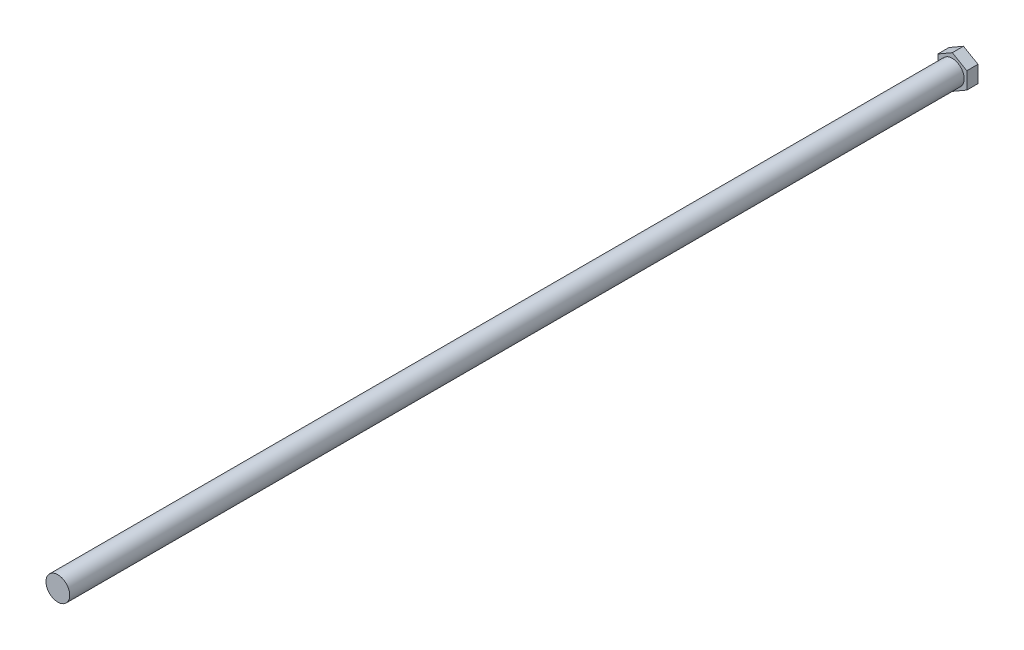
ISO-10303-21;
HEADER;
FILE_DESCRIPTION(('STEP AP214'),'2;1');
FILE_NAME('part.step','',(''),(''),'','','');
FILE_SCHEMA(('AUTOMOTIVE_DESIGN { 1 0 10303 214 1 1 1 1 }'));
ENDSEC;
DATA;
#1=APPLICATION_CONTEXT('core data for automotive mechanical design processes');
#2=APPLICATION_PROTOCOL_DEFINITION('international standard','automotive_design',2000,#1);
#3=PRODUCT_CONTEXT('',#1,'mechanical');
#4=PRODUCT('Part','Part','',(#3));
#5=PRODUCT_RELATED_PRODUCT_CATEGORY('part','',(#4));
#6=PRODUCT_DEFINITION_FORMATION('','',#4);
#7=PRODUCT_DEFINITION_CONTEXT('part definition',#1,'design');
#8=PRODUCT_DEFINITION('design','',#6,#7);
#9=PRODUCT_DEFINITION_SHAPE('','',#8);
#10=(LENGTH_UNIT() NAMED_UNIT(*) SI_UNIT(.MILLI.,.METRE.));
#11=(NAMED_UNIT(*) PLANE_ANGLE_UNIT() SI_UNIT($,.RADIAN.));
#12=(NAMED_UNIT(*) SI_UNIT($,.STERADIAN.) SOLID_ANGLE_UNIT());
#13=UNCERTAINTY_MEASURE_WITH_UNIT(LENGTH_MEASURE(1.E-05),#10,'distance_accuracy_value','');
#14=(GEOMETRIC_REPRESENTATION_CONTEXT(3) GLOBAL_UNCERTAINTY_ASSIGNED_CONTEXT((#13)) GLOBAL_UNIT_ASSIGNED_CONTEXT((#10,
#11,#12)) REPRESENTATION_CONTEXT('',''));
#15=CARTESIAN_POINT('',(0.,0.,0.));
#16=DIRECTION('',(0.,0.,1.));
#17=DIRECTION('',(1.,0.,0.));
#18=AXIS2_PLACEMENT_3D('',#15,#16,#17);
#19=CARTESIAN_POINT('',(0.,0.,160.));
#20=DIRECTION('',(0.,0.,-1.));
#21=DIRECTION('',(-1.,0.,0.));
#22=AXIS2_PLACEMENT_3D('',#19,#20,#21);
#23=CYLINDRICAL_SURFACE('',#22,2.125);
#24=CARTESIAN_POINT('',(0.,0.,160.));
#25=DIRECTION('',(0.,0.,1.));
#26=DIRECTION('',(1.,0.,0.));
#27=AXIS2_PLACEMENT_3D('',#24,#25,#26);
#28=CIRCLE('',#27,2.125);
#29=CARTESIAN_POINT('',(2.125,0.,160.));
#30=VERTEX_POINT('',#29);
#31=EDGE_CURVE('E11',#30,#30,#28,.T.);
#32=ORIENTED_EDGE('',*,*,#31,.F.);
#33=EDGE_LOOP('',(#32));
#34=FACE_BOUND('',#33,.T.);
#35=CARTESIAN_POINT('',(0.,0.,0.));
#36=DIRECTION('',(0.,0.,1.));
#37=DIRECTION('',(1.,0.,0.));
#38=AXIS2_PLACEMENT_3D('',#35,#36,#37);
#39=CIRCLE('',#38,2.125);
#40=CARTESIAN_POINT('',(2.125,0.,0.));
#41=VERTEX_POINT('',#40);
#42=EDGE_CURVE('E48',#41,#41,#39,.T.);
#43=ORIENTED_EDGE('',*,*,#42,.T.);
#44=EDGE_LOOP('',(#43));
#45=FACE_BOUND('',#44,.T.);
#46=ADVANCED_FACE('F45',(#34,#45),#23,.T.);
#47=CARTESIAN_POINT('',(0.,0.,160.));
#48=DIRECTION('',(0.,0.,1.));
#49=DIRECTION('',(1.,0.,0.));
#50=AXIS2_PLACEMENT_3D('',#47,#48,#49);
#51=PLANE('',#50);
#52=ORIENTED_EDGE('',*,*,#31,.T.);
#53=EDGE_LOOP('',(#52));
#54=FACE_BOUND('',#53,.T.);
#55=ADVANCED_FACE('F189',(#54),#51,.T.);
#56=CARTESIAN_POINT('',(-2.59807621135332,1.5,-2.));
#57=DIRECTION('',(0.5,-0.866025403784439,0.));
#58=DIRECTION('',(0.866025403784439,0.5,0.));
#59=AXIS2_PLACEMENT_3D('',#56,#57,#58);
#60=PLANE('',#59);
#61=DIRECTION('',(0.866025403784439,0.5,0.));
#62=VECTOR('',#61,1.);
#63=CARTESIAN_POINT('',(-2.59807621135332,1.5,0.));
#64=LINE('',#63,#62);
#65=CARTESIAN_POINT('',(-2.59807621135332,1.5,0.));
#66=VERTEX_POINT('',#65);
#67=CARTESIAN_POINT('',(0.,3.,0.));
#68=VERTEX_POINT('',#67);
#69=EDGE_CURVE('E135',#66,#68,#64,.T.);
#70=ORIENTED_EDGE('',*,*,#69,.T.);
#71=DIRECTION('',(0.,0.,1.));
#72=VECTOR('',#71,1.);
#73=CARTESIAN_POINT('',(0.,3.,-2.));
#74=LINE('',#73,#72);
#75=CARTESIAN_POINT('',(0.,3.,-2.));
#76=VERTEX_POINT('',#75);
#77=EDGE_CURVE('E162',#76,#68,#74,.T.);
#78=ORIENTED_EDGE('',*,*,#77,.F.);
#79=DIRECTION('',(0.866025403784439,0.5,0.));
#80=VECTOR('',#79,1.);
#81=CARTESIAN_POINT('',(-2.59807621135332,1.5,-2.));
#82=LINE('',#81,#80);
#83=CARTESIAN_POINT('',(-2.59807621135332,1.5,-2.));
#84=VERTEX_POINT('',#83);
#85=EDGE_CURVE('E151',#84,#76,#82,.T.);
#86=ORIENTED_EDGE('',*,*,#85,.F.);
#87=DIRECTION('',(0.,0.,1.));
#88=VECTOR('',#87,1.);
#89=CARTESIAN_POINT('',(-2.59807621135332,1.5,-2.));
#90=LINE('',#89,#88);
#91=EDGE_CURVE('E131',#84,#66,#90,.T.);
#92=ORIENTED_EDGE('',*,*,#91,.T.);
#93=EDGE_LOOP('',(#70,#78,#86,#92));
#94=FACE_BOUND('',#93,.T.);
#95=ADVANCED_FACE('F177',(#94),#60,.F.);
#96=CARTESIAN_POINT('',(0.,3.,-2.));
#97=DIRECTION('',(-0.5,-0.866025403784439,0.));
#98=DIRECTION('',(0.866025403784439,-0.5,0.));
#99=AXIS2_PLACEMENT_3D('',#96,#97,#98);
#100=PLANE('',#99);
#101=DIRECTION('',(0.866025403784439,-0.5,0.));
#102=VECTOR('',#101,1.);
#103=CARTESIAN_POINT('',(0.,3.,0.));
#104=LINE('',#103,#102);
#105=CARTESIAN_POINT('',(2.59807621135332,1.5,0.));
#106=VERTEX_POINT('',#105);
#107=EDGE_CURVE('E139',#68,#106,#104,.T.);
#108=ORIENTED_EDGE('',*,*,#107,.T.);
#109=DIRECTION('',(0.,0.,1.));
#110=VECTOR('',#109,1.);
#111=CARTESIAN_POINT('',(2.59807621135332,1.5,-2.));
#112=LINE('',#111,#110);
#113=CARTESIAN_POINT('',(2.59807621135332,1.5,-2.));
#114=VERTEX_POINT('',#113);
#115=EDGE_CURVE('E158',#114,#106,#112,.T.);
#116=ORIENTED_EDGE('',*,*,#115,.F.);
#117=DIRECTION('',(0.866025403784439,-0.5,0.));
#118=VECTOR('',#117,1.);
#119=CARTESIAN_POINT('',(0.,3.,-2.));
#120=LINE('',#119,#118);
#121=EDGE_CURVE('E100',#76,#114,#120,.T.);
#122=ORIENTED_EDGE('',*,*,#121,.F.);
#123=ORIENTED_EDGE('',*,*,#77,.T.);
#124=EDGE_LOOP('',(#108,#116,#122,#123));
#125=FACE_BOUND('',#124,.T.);
#126=ADVANCED_FACE('F199',(#125),#100,.F.);
#127=CARTESIAN_POINT('',(2.59807621135332,1.5,-2.));
#128=DIRECTION('',(-1.,0.,0.));
#129=DIRECTION('',(0.,-1.,0.));
#130=AXIS2_PLACEMENT_3D('',#127,#128,#129);
#131=PLANE('',#130);
#132=DIRECTION('',(0.,-1.,0.));
#133=VECTOR('',#132,1.);
#134=CARTESIAN_POINT('',(2.59807621135332,1.5,0.));
#135=LINE('',#134,#133);
#136=CARTESIAN_POINT('',(2.59807621135332,-1.5,0.));
#137=VERTEX_POINT('',#136);
#138=EDGE_CURVE('E142',#106,#137,#135,.T.);
#139=ORIENTED_EDGE('',*,*,#138,.T.);
#140=DIRECTION('',(0.,0.,1.));
#141=VECTOR('',#140,1.);
#142=CARTESIAN_POINT('',(2.59807621135332,-1.5,-2.));
#143=LINE('',#142,#141);
#144=CARTESIAN_POINT('',(2.59807621135332,-1.5,-2.));
#145=VERTEX_POINT('',#144);
#146=EDGE_CURVE('E124',#145,#137,#143,.T.);
#147=ORIENTED_EDGE('',*,*,#146,.F.);
#148=DIRECTION('',(0.,-1.,0.));
#149=VECTOR('',#148,1.);
#150=CARTESIAN_POINT('',(2.59807621135332,1.5,-2.));
#151=LINE('',#150,#149);
#152=EDGE_CURVE('E113',#114,#145,#151,.T.);
#153=ORIENTED_EDGE('',*,*,#152,.F.);
#154=ORIENTED_EDGE('',*,*,#115,.T.);
#155=EDGE_LOOP('',(#139,#147,#153,#154));
#156=FACE_BOUND('',#155,.T.);
#157=ADVANCED_FACE('F204',(#156),#131,.F.);
#158=CARTESIAN_POINT('',(2.59807621135332,-1.5,-2.));
#159=DIRECTION('',(-0.5,0.866025403784439,0.));
#160=DIRECTION('',(-0.866025403784439,-0.5,0.));
#161=AXIS2_PLACEMENT_3D('',#158,#159,#160);
#162=PLANE('',#161);
#163=DIRECTION('',(-0.866025403784439,-0.5,0.));
#164=VECTOR('',#163,1.);
#165=CARTESIAN_POINT('',(2.59807621135332,-1.5,0.));
#166=LINE('',#165,#164);
#167=CARTESIAN_POINT('',(0.,-3.,0.));
#168=VERTEX_POINT('',#167);
#169=EDGE_CURVE('E122',#137,#168,#166,.T.);
#170=ORIENTED_EDGE('',*,*,#169,.T.);
#171=DIRECTION('',(0.,0.,1.));
#172=VECTOR('',#171,1.);
#173=CARTESIAN_POINT('',(0.,-3.,-2.));
#174=LINE('',#173,#172);
#175=CARTESIAN_POINT('',(0.,-3.,-2.));
#176=VERTEX_POINT('',#175);
#177=EDGE_CURVE('E119',#176,#168,#174,.T.);
#178=ORIENTED_EDGE('',*,*,#177,.F.);
#179=DIRECTION('',(-0.866025403784439,-0.5,0.));
#180=VECTOR('',#179,1.);
#181=CARTESIAN_POINT('',(2.59807621135332,-1.5,-2.));
#182=LINE('',#181,#180);
#183=EDGE_CURVE('E107',#145,#176,#182,.T.);
#184=ORIENTED_EDGE('',*,*,#183,.F.);
#185=ORIENTED_EDGE('',*,*,#146,.T.);
#186=EDGE_LOOP('',(#170,#178,#184,#185));
#187=FACE_BOUND('',#186,.T.);
#188=ADVANCED_FACE('F120',(#187),#162,.F.);
#189=CARTESIAN_POINT('',(0.,-3.,-2.));
#190=DIRECTION('',(0.5,0.866025403784439,0.));
#191=DIRECTION('',(-0.866025403784439,0.5,0.));
#192=AXIS2_PLACEMENT_3D('',#189,#190,#191);
#193=PLANE('',#192);
#194=DIRECTION('',(-0.866025403784439,0.5,0.));
#195=VECTOR('',#194,1.);
#196=CARTESIAN_POINT('',(0.,-3.,0.));
#197=LINE('',#196,#195);
#198=CARTESIAN_POINT('',(-2.59807621135332,-1.5,0.));
#199=VERTEX_POINT('',#198);
#200=EDGE_CURVE('E85',#168,#199,#197,.T.);
#201=ORIENTED_EDGE('',*,*,#200,.T.);
#202=DIRECTION('',(0.,0.,1.));
#203=VECTOR('',#202,1.);
#204=CARTESIAN_POINT('',(-2.59807621135332,-1.5,-2.));
#205=LINE('',#204,#203);
#206=CARTESIAN_POINT('',(-2.59807621135332,-1.5,-2.));
#207=VERTEX_POINT('',#206);
#208=EDGE_CURVE('E125',#207,#199,#205,.T.);
#209=ORIENTED_EDGE('',*,*,#208,.F.);
#210=DIRECTION('',(-0.866025403784439,0.5,0.));
#211=VECTOR('',#210,1.);
#212=CARTESIAN_POINT('',(0.,-3.,-2.));
#213=LINE('',#212,#211);
#214=EDGE_CURVE('E111',#176,#207,#213,.T.);
#215=ORIENTED_EDGE('',*,*,#214,.F.);
#216=ORIENTED_EDGE('',*,*,#177,.T.);
#217=EDGE_LOOP('',(#201,#209,#215,#216));
#218=FACE_BOUND('',#217,.T.);
#219=ADVANCED_FACE('F127',(#218),#193,.F.);
#220=CARTESIAN_POINT('',(-2.59807621135332,-1.5,-2.));
#221=DIRECTION('',(1.,0.,0.));
#222=DIRECTION('',(0.,1.,0.));
#223=AXIS2_PLACEMENT_3D('',#220,#221,#222);
#224=PLANE('',#223);
#225=DIRECTION('',(0.,1.,0.));
#226=VECTOR('',#225,1.);
#227=CARTESIAN_POINT('',(-2.59807621135332,-1.5,0.));
#228=LINE('',#227,#226);
#229=EDGE_CURVE('E91',#199,#66,#228,.T.);
#230=ORIENTED_EDGE('',*,*,#229,.T.);
#231=ORIENTED_EDGE('',*,*,#91,.F.);
#232=DIRECTION('',(0.,1.,0.));
#233=VECTOR('',#232,1.);
#234=CARTESIAN_POINT('',(-2.59807621135332,-1.5,-2.));
#235=LINE('',#234,#233);
#236=EDGE_CURVE('E62',#207,#84,#235,.T.);
#237=ORIENTED_EDGE('',*,*,#236,.F.);
#238=ORIENTED_EDGE('',*,*,#208,.T.);
#239=EDGE_LOOP('',(#230,#231,#237,#238));
#240=FACE_BOUND('',#239,.T.);
#241=ADVANCED_FACE('F179',(#240),#224,.F.);
#242=CARTESIAN_POINT('',(0.,0.,-2.));
#243=DIRECTION('',(0.,0.,-1.));
#244=DIRECTION('',(-1.,0.,0.));
#245=AXIS2_PLACEMENT_3D('',#242,#243,#244);
#246=PLANE('',#245);
#247=ORIENTED_EDGE('',*,*,#85,.T.);
#248=ORIENTED_EDGE('',*,*,#121,.T.);
#249=ORIENTED_EDGE('',*,*,#152,.T.);
#250=ORIENTED_EDGE('',*,*,#183,.T.);
#251=ORIENTED_EDGE('',*,*,#214,.T.);
#252=ORIENTED_EDGE('',*,*,#236,.T.);
#253=EDGE_LOOP('',(#247,#248,#249,#250,#251,#252));
#254=FACE_BOUND('',#253,.T.);
#255=ADVANCED_FACE('F109',(#254),#246,.T.);
#256=CARTESIAN_POINT('',(0.,0.,0.));
#257=DIRECTION('',(0.,0.,-1.));
#258=DIRECTION('',(-1.,0.,0.));
#259=AXIS2_PLACEMENT_3D('',#256,#257,#258);
#260=PLANE('',#259);
#261=ORIENTED_EDGE('',*,*,#42,.F.);
#262=EDGE_LOOP('',(#261));
#263=FACE_BOUND('',#262,.T.);
#264=ORIENTED_EDGE('',*,*,#69,.F.);
#265=ORIENTED_EDGE('',*,*,#229,.F.);
#266=ORIENTED_EDGE('',*,*,#200,.F.);
#267=ORIENTED_EDGE('',*,*,#169,.F.);
#268=ORIENTED_EDGE('',*,*,#138,.F.);
#269=ORIENTED_EDGE('',*,*,#107,.F.);
#270=EDGE_LOOP('',(#264,#265,#266,#267,#268,#269));
#271=FACE_BOUND('',#270,.T.);
#272=ADVANCED_FACE('F170',(#263,#271),#260,.F.);
#273=CLOSED_SHELL('',(#46,#55,#95,#126,#157,#188,#219,#241,#255,#272));
#274=MANIFOLD_SOLID_BREP('B2',#273);
#275=ADVANCED_BREP_SHAPE_REPRESENTATION('',(#18,#274),#14);
#276=SHAPE_DEFINITION_REPRESENTATION(#9,#275);
ENDSEC;
END-ISO-10303-21;
